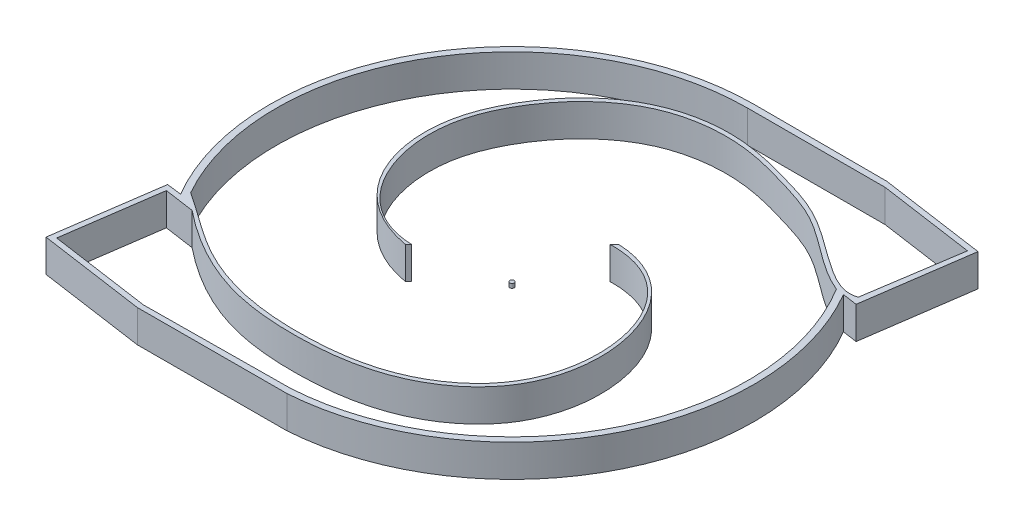
ISO-10303-21;
HEADER;
FILE_DESCRIPTION(('STEP AP214'),'2;1');
FILE_NAME('part.step','',(''),(''),'','','');
FILE_SCHEMA(('AUTOMOTIVE_DESIGN { 1 0 10303 214 1 1 1 1 }'));
ENDSEC;
DATA;
#1=APPLICATION_CONTEXT('core data for automotive mechanical design processes');
#2=APPLICATION_PROTOCOL_DEFINITION('international standard','automotive_design',2000,#1);
#3=PRODUCT_CONTEXT('',#1,'mechanical');
#4=PRODUCT('Part','Part','',(#3));
#5=PRODUCT_RELATED_PRODUCT_CATEGORY('part','',(#4));
#6=PRODUCT_DEFINITION_FORMATION('','',#4);
#7=PRODUCT_DEFINITION_CONTEXT('part definition',#1,'design');
#8=PRODUCT_DEFINITION('design','',#6,#7);
#9=PRODUCT_DEFINITION_SHAPE('','',#8);
#10=(LENGTH_UNIT() NAMED_UNIT(*) SI_UNIT(.MILLI.,.METRE.));
#11=(NAMED_UNIT(*) PLANE_ANGLE_UNIT() SI_UNIT($,.RADIAN.));
#12=(NAMED_UNIT(*) SI_UNIT($,.STERADIAN.) SOLID_ANGLE_UNIT());
#13=UNCERTAINTY_MEASURE_WITH_UNIT(LENGTH_MEASURE(1.E-05),#10,'distance_accuracy_value','');
#14=(GEOMETRIC_REPRESENTATION_CONTEXT(3) GLOBAL_UNCERTAINTY_ASSIGNED_CONTEXT((#13)) GLOBAL_UNIT_ASSIGNED_CONTEXT((#10,
#11,#12)) REPRESENTATION_CONTEXT('',''));
#15=CARTESIAN_POINT('',(0.,0.,0.));
#16=DIRECTION('',(0.,0.,1.));
#17=DIRECTION('',(1.,0.,0.));
#18=AXIS2_PLACEMENT_3D('',#15,#16,#17);
#19=CARTESIAN_POINT('',(0.,-2.,0.));
#20=DIRECTION('',(0.,1.,0.));
#21=DIRECTION('',(0.,0.,1.));
#22=AXIS2_PLACEMENT_3D('',#19,#20,#21);
#23=CYLINDRICAL_SURFACE('',#22,1.);
#24=CARTESIAN_POINT('',(0.,-2.,0.));
#25=DIRECTION('',(0.,-1.,0.));
#26=DIRECTION('',(0.,0.,-1.));
#27=AXIS2_PLACEMENT_3D('',#24,#25,#26);
#28=CIRCLE('',#27,1.);
#29=CARTESIAN_POINT('',(0.,-2.,-1.));
#30=VERTEX_POINT('',#29);
#31=EDGE_CURVE('E11',#30,#30,#28,.T.);
#32=ORIENTED_EDGE('',*,*,#31,.F.);
#33=EDGE_LOOP('',(#32));
#34=FACE_BOUND('',#33,.T.);
#35=CARTESIAN_POINT('',(0.,0.,0.));
#36=DIRECTION('',(0.,-1.,0.));
#37=DIRECTION('',(0.,0.,-1.));
#38=AXIS2_PLACEMENT_3D('',#35,#36,#37);
#39=CIRCLE('',#38,1.);
#40=CARTESIAN_POINT('',(0.,0.,-1.));
#41=VERTEX_POINT('',#40);
#42=EDGE_CURVE('E48',#41,#41,#39,.T.);
#43=ORIENTED_EDGE('',*,*,#42,.T.);
#44=EDGE_LOOP('',(#43));
#45=FACE_BOUND('',#44,.T.);
#46=ADVANCED_FACE('F45',(#34,#45),#23,.T.);
#47=CARTESIAN_POINT('',(0.,-2.,0.));
#48=DIRECTION('',(0.,-1.,0.));
#49=DIRECTION('',(0.,0.,-1.));
#50=AXIS2_PLACEMENT_3D('',#47,#48,#49);
#51=PLANE('',#50);
#52=ORIENTED_EDGE('',*,*,#31,.T.);
#53=EDGE_LOOP('',(#52));
#54=FACE_BOUND('',#53,.T.);
#55=ADVANCED_FACE('F60',(#54),#51,.T.);
#56=CARTESIAN_POINT('',(0.,0.,0.));
#57=DIRECTION('',(0.,-1.,0.));
#58=DIRECTION('',(0.,0.,-1.));
#59=AXIS2_PLACEMENT_3D('',#56,#57,#58);
#60=PLANE('',#59);
#61=ORIENTED_EDGE('',*,*,#42,.F.);
#62=EDGE_LOOP('',(#61));
#63=FACE_BOUND('',#62,.T.);
#64=ADVANCED_FACE('F58',(#63),#60,.F.);
#65=CLOSED_SHELL('',(#46,#55,#64));
#66=MANIFOLD_SOLID_BREP('B2',#65);
#67=CARTESIAN_POINT('',(0.,15.,0.));
#68=DIRECTION('',(0.,1.,0.));
#69=DIRECTION('',(0.,0.,1.));
#70=AXIS2_PLACEMENT_3D('',#67,#68,#69);
#71=PLANE('',#70);
#72=DIRECTION('',(0.989838582297065,0.,0.142195573053936));
#73=VECTOR('',#72,1.);
#74=CARTESIAN_POINT('',(-111.098134084695,15.,105.272050435523));
#75=LINE('',#74,#73);
#76=CARTESIAN_POINT('',(-111.098134084695,15.,105.272050435523));
#77=VERTEX_POINT('',#76);
#78=CARTESIAN_POINT('',(-61.6062049698414,15.,112.38182908822));
#79=VERTEX_POINT('',#78);
#80=EDGE_CURVE('E392',#77,#79,#75,.T.);
#81=ORIENTED_EDGE('',*,*,#80,.T.);
#82=DIRECTION('',(0.999997555947493,0.,-0.00221090457529426));
#83=VECTOR('',#82,1.);
#84=CARTESIAN_POINT('',(-61.6062049698414,15.,112.38182908822));
#85=LINE('',#84,#83);
#86=CARTESIAN_POINT('',(7.81330436556181,15.,112.228348802302));
#87=VERTEX_POINT('',#86);
#88=EDGE_CURVE('E423',#79,#87,#85,.T.);
#89=ORIENTED_EDGE('',*,*,#88,.T.);
#90=CARTESIAN_POINT('',(0.,15.,0.));
#91=DIRECTION('',(0.,1.,0.));
#92=DIRECTION('',(0.,0.,1.));
#93=AXIS2_PLACEMENT_3D('',#90,#91,#92);
#94=CIRCLE('',#93,112.5);
#95=CARTESIAN_POINT('',(97.1283531466702,15.,-56.7655971078939));
#96=VERTEX_POINT('',#95);
#97=EDGE_CURVE('E370',#87,#96,#94,.T.);
#98=ORIENTED_EDGE('',*,*,#97,.T.);
#99=DIRECTION('',(0.989838582297064,0.,0.142195573053939));
#100=VECTOR('',#99,1.);
#101=CARTESIAN_POINT('',(103.988355431997,15.,-55.7801213206704));
#102=LINE('',#101,#100);
#103=CARTESIAN_POINT('',(103.988355431997,15.,-55.7801213206704));
#104=VERTEX_POINT('',#103);
#105=EDGE_CURVE('E417',#96,#104,#102,.T.);
#106=ORIENTED_EDGE('',*,*,#105,.T.);
#107=DIRECTION('',(0.142195573053937,0.,-0.989838582297064));
#108=VECTOR('',#107,1.);
#109=CARTESIAN_POINT('',(111.098134084694,15.,-105.272050435524));
#110=LINE('',#109,#108);
#111=CARTESIAN_POINT('',(111.098134084694,15.,-105.272050435524));
#112=VERTEX_POINT('',#111);
#113=EDGE_CURVE('E419',#104,#112,#110,.T.);
#114=ORIENTED_EDGE('',*,*,#113,.T.);
#115=DIRECTION('',(-0.989838582297064,0.,-0.142195573053938));
#116=VECTOR('',#115,1.);
#117=CARTESIAN_POINT('',(61.6062049698404,15.,-112.38182908822));
#118=LINE('',#117,#116);
#119=CARTESIAN_POINT('',(61.6062049698404,15.,-112.38182908822));
#120=VERTEX_POINT('',#119);
#121=EDGE_CURVE('E421',#112,#120,#118,.T.);
#122=ORIENTED_EDGE('',*,*,#121,.T.);
#123=DIRECTION('',(-0.999998153852846,0.,-0.00192153347591024));
#124=VECTOR('',#123,1.);
#125=CARTESIAN_POINT('',(0.216172516040019,15.,-112.499792308445));
#126=LINE('',#125,#124);
#127=CARTESIAN_POINT('',(0.216172516040015,15.,-112.499792308445));
#128=VERTEX_POINT('',#127);
#129=EDGE_CURVE('E428',#120,#128,#126,.T.);
#130=ORIENTED_EDGE('',*,*,#129,.T.);
#131=CARTESIAN_POINT('',(0.,15.,0.));
#132=DIRECTION('',(0.,1.,0.));
#133=DIRECTION('',(0.,0.,1.));
#134=AXIS2_PLACEMENT_3D('',#131,#132,#133);
#135=CIRCLE('',#134,112.5);
#136=CARTESIAN_POINT('',(-97.1283531467345,15.,56.7655971077838));
#137=VERTEX_POINT('',#136);
#138=EDGE_CURVE('E430',#128,#137,#135,.T.);
#139=ORIENTED_EDGE('',*,*,#138,.T.);
#140=DIRECTION('',(-0.99215332647358,0.,-0.125027104131105));
#141=VECTOR('',#140,1.);
#142=CARTESIAN_POINT('',(-97.1283531467345,15.,56.7655971077838));
#143=LINE('',#142,#141);
#144=CARTESIAN_POINT('',(-104.005429548138,15.,55.8989760680581));
#145=VERTEX_POINT('',#144);
#146=EDGE_CURVE('E432',#137,#145,#143,.T.);
#147=ORIENTED_EDGE('',*,*,#146,.T.);
#148=DIRECTION('',(-0.142195573053945,0.,0.989838582297063));
#149=VECTOR('',#148,1.);
#150=CARTESIAN_POINT('',(-104.005429548138,15.,55.8989760680581));
#151=LINE('',#150,#149);
#152=EDGE_CURVE('E397',#145,#77,#151,.T.);
#153=ORIENTED_EDGE('',*,*,#152,.T.);
#154=EDGE_LOOP('',(#81,#89,#98,#106,#114,#122,#130,#139,#147,#153));
#155=FACE_BOUND('',#154,.T.);
#156=DIRECTION('',(0.150937206661829,0.,-0.988543352435858));
#157=VECTOR('',#156,1.);
#158=CARTESIAN_POINT('',(108.356962433617,15.,-103.140169981502));
#159=LINE('',#158,#157);
#160=CARTESIAN_POINT('',(101.651112979556,15.,-59.2210923275775));
#161=VERTEX_POINT('',#160);
#162=CARTESIAN_POINT('',(108.356962433617,15.,-103.140169981502));
#163=VERTEX_POINT('',#162);
#164=EDGE_CURVE('E255',#161,#163,#159,.T.);
#165=ORIENTED_EDGE('',*,*,#164,.F.);
#166=CARTESIAN_POINT('',(-24.7487373415292,15.,24.7487373415291));
#167=CARTESIAN_POINT('',(-57.6088522938292,15.,18.867382228917));
#168=CARTESIAN_POINT('',(-72.3021396488468,15.,-19.8249873152464));
#169=CARTESIAN_POINT('',(-54.9322718394747,15.,-63.3855746473588));
#170=CARTESIAN_POINT('',(-30.7206221507859,15.,-90.556775661547));
#171=CARTESIAN_POINT('',(10.898716901952,15.,-98.1526440490121));
#172=CARTESIAN_POINT('',(40.3725343305734,15.,-88.6774294833396));
#173=CARTESIAN_POINT('',(38.8536834725888,15.,-89.1413172088945));
#174=CARTESIAN_POINT('',(67.35044256654,15.,-81.8497237142579));
#175=CARTESIAN_POINT('',(91.0384209035717,15.,-54.8393633440072));
#176=CARTESIAN_POINT('',(101.651112979556,15.,-59.2210923275775));
#177=B_SPLINE_CURVE_WITH_KNOTS('',3,(#166,#167,#168,#169,#170,#171,#172,#173,#174,#175,#176),
.UNSPECIFIED.,.F.,.F.,(4,1,1,1,1,1,1,1,4),(0.,0.277456928091752,0.362270070175911,
0.527471754866319,0.633154577027563,0.719972673822301,0.738643837156515,0.8198662103697,1.),.UNSPECIFIED.);
#178=CARTESIAN_POINT('',(-24.7487373415292,15.,24.7487373415291));
#179=VERTEX_POINT('',#178);
#180=EDGE_CURVE('E247',#179,#161,#177,.T.);
#181=ORIENTED_EDGE('',*,*,#180,.F.);
#182=DIRECTION('',(-0.707106781186547,0.,0.707106781186547));
#183=VECTOR('',#182,1.);
#184=CARTESIAN_POINT('',(-23.3345237791561,15.,23.334523779156));
#185=LINE('',#184,#183);
#186=CARTESIAN_POINT('',(-23.3345237791561,15.,23.334523779156));
#187=VERTEX_POINT('',#186);
#188=EDGE_CURVE('E480',#187,#179,#185,.T.);
#189=ORIENTED_EDGE('',*,*,#188,.F.);
#190=CARTESIAN_POINT('',(93.3016841858716,15.,-57.3153184417559));
#191=CARTESIAN_POINT('',(79.999859792646,15.,-62.7848687055692));
#192=CARTESIAN_POINT('',(65.322911503869,15.,-78.768171948633));
#193=CARTESIAN_POINT('',(37.4032729980651,15.,-87.7996070681582));
#194=CARTESIAN_POINT('',(11.7544837331423,15.,-95.0233278977322));
#195=CARTESIAN_POINT('',(-26.3511202667367,15.,-90.7646059425298));
#196=CARTESIAN_POINT('',(-52.9708137900069,15.,-63.4030913343276));
#197=CARTESIAN_POINT('',(-70.9286409504266,15.,-17.7732911126449));
#198=CARTESIAN_POINT('',(-53.1428699296483,15.,22.1928285556717));
#199=CARTESIAN_POINT('',(-23.3345237791561,15.,23.334523779156));
#200=B_SPLINE_CURVE_WITH_KNOTS('',3,(#190,#191,#192,#193,#194,#195,#196,#197,#198,#199),
.UNSPECIFIED.,.F.,.F.,(4,1,1,1,1,1,1,4),(0.,0.160043116734064,0.228106362998641,
0.324072816988821,0.456717013954585,0.632884802041081,0.715223579823086,1.),.UNSPECIFIED.);
#201=CARTESIAN_POINT('',(93.3016841858716,15.,-57.3153184417559));
#202=VERTEX_POINT('',#201);
#203=EDGE_CURVE('E542',#202,#187,#200,.T.);
#204=ORIENTED_EDGE('',*,*,#203,.F.);
#205=CARTESIAN_POINT('',(0.,15.,0.));
#206=DIRECTION('',(0.,1.,0.));
#207=DIRECTION('',(0.,0.,1.));
#208=AXIS2_PLACEMENT_3D('',#205,#206,#207);
#209=CIRCLE('',#208,109.5);
#210=CARTESIAN_POINT('',(6.52858444374937,15.,109.305203833856));
#211=VERTEX_POINT('',#210);
#212=EDGE_CURVE('E547',#211,#202,#209,.T.);
#213=ORIENTED_EDGE('',*,*,#212,.F.);
#214=DIRECTION('',(0.999960555676879,0.,-0.00888184048428879));
#215=VECTOR('',#214,1.);
#216=CARTESIAN_POINT('',(-61.2507160203775,15.,109.907232515329));
#217=LINE('',#216,#215);
#218=CARTESIAN_POINT('',(-61.2507160203775,15.,109.907232515329));
#219=VERTEX_POINT('',#218);
#220=EDGE_CURVE('E594',#219,#211,#217,.T.);
#221=ORIENTED_EDGE('',*,*,#220,.F.);
#222=DIRECTION('',(0.98983858265136,0.,0.142195570587646));
#223=VECTOR('',#222,1.);
#224=CARTESIAN_POINT('',(-61.2507160203775,15.,109.907232515329));
#225=LINE('',#224,#223);
#226=CARTESIAN_POINT('',(-108.268048696317,15.,103.152942912416));
#227=VERTEX_POINT('',#226);
#228=EDGE_CURVE('E593',#227,#219,#225,.T.);
#229=ORIENTED_EDGE('',*,*,#228,.F.);
#230=DIRECTION('',(-0.142195573053947,0.,0.989838582297063));
#231=VECTOR('',#230,1.);
#232=CARTESIAN_POINT('',(-108.268048696317,15.,103.152942912416));
#233=LINE('',#232,#231);
#234=CARTESIAN_POINT('',(-101.86924790889,15.,58.6102067090479));
#235=VERTEX_POINT('',#234);
#236=EDGE_CURVE('E591',#235,#227,#233,.T.);
#237=ORIENTED_EDGE('',*,*,#236,.F.);
#238=DIRECTION('',(-0.989838582297064,0.,-0.142195573053942));
#239=VECTOR('',#238,1.);
#240=CARTESIAN_POINT('',(-101.86924790889,15.,58.6102067090479));
#241=LINE('',#240,#239);
#242=CARTESIAN_POINT('',(-87.9163615031018,15.,60.6146129968118));
#243=VERTEX_POINT('',#242);
#244=EDGE_CURVE('E586',#243,#235,#241,.T.);
#245=ORIENTED_EDGE('',*,*,#244,.F.);
#246=CARTESIAN_POINT('',(24.7487373415291,15.,-24.7487373415292));
#247=CARTESIAN_POINT('',(51.7370589735834,15.,-23.6621696705015));
#248=CARTESIAN_POINT('',(72.1160836691228,15.,11.8170428928419));
#249=CARTESIAN_POINT('',(59.7862809228424,15.,59.0149245980405));
#250=CARTESIAN_POINT('',(28.2090400860088,15.,83.0352889135964));
#251=CARTESIAN_POINT('',(-9.82261115237183,15.,88.3388256270936));
#252=CARTESIAN_POINT('',(-51.5864280904056,15.,84.7534168675822));
#253=CARTESIAN_POINT('',(-75.972753664596,15.,70.2918559629893));
#254=CARTESIAN_POINT('',(-87.9163615031018,15.,60.6146129968118));
#255=B_SPLINE_CURVE_WITH_KNOTS('',3,(#246,#247,#248,#249,#250,#251,#252,#253,#254),
.UNSPECIFIED.,.F.,.F.,(4,1,1,1,1,1,4),(0.,0.260567980555586,0.392123414841288,0.526871298776947,
0.686922118744908,0.822471855273197,1.),.UNSPECIFIED.);
#256=CARTESIAN_POINT('',(24.7487373415291,15.,-24.7487373415292));
#257=VERTEX_POINT('',#256);
#258=EDGE_CURVE('E581',#257,#243,#255,.T.);
#259=ORIENTED_EDGE('',*,*,#258,.F.);
#260=DIRECTION('',(0.707106781186552,0.,-0.707106781186543));
#261=VECTOR('',#260,1.);
#262=CARTESIAN_POINT('',(22.7487373415291,15.,-22.7487373415292));
#263=LINE('',#262,#261);
#264=CARTESIAN_POINT('',(22.7487373415291,15.,-22.7487373415292));
#265=VERTEX_POINT('',#264);
#266=EDGE_CURVE('E284',#265,#257,#263,.T.);
#267=ORIENTED_EDGE('',*,*,#266,.F.);
#268=CARTESIAN_POINT('',(-95.321840889812,15.,53.8887432529036));
#269=CARTESIAN_POINT('',(-85.595236890725,15.,60.1599095727363));
#270=CARTESIAN_POINT('',(-71.2177238612191,15.,72.0334175299913));
#271=CARTESIAN_POINT('',(-42.2900753972253,15.,83.597289834803));
#272=CARTESIAN_POINT('',(-9.76379503867826,15.,86.3617363395996));
#273=CARTESIAN_POINT('',(27.6960347768642,15.,80.9951888851578));
#274=CARTESIAN_POINT('',(58.3489292927927,15.,57.6593810689266));
#275=CARTESIAN_POINT('',(70.0831906316323,15.,11.1972146755611));
#276=CARTESIAN_POINT('',(50.5690623695877,15.,-23.495909322841));
#277=CARTESIAN_POINT('',(22.7487373415291,15.,-22.7487373415292));
#278=B_SPLINE_CURVE_WITH_KNOTS('',3,(#268,#269,#270,#271,#272,#273,#274,#275,#276,#277),
.UNSPECIFIED.,.F.,.F.,(4,1,1,1,1,1,1,4),(0.,0.130192876402193,0.206823632700945,
0.345938150979102,0.492014560699875,0.6235083770681,0.750750137569799,1.),.UNSPECIFIED.);
#279=CARTESIAN_POINT('',(-95.321840889812,15.,53.8887432529036));
#280=VERTEX_POINT('',#279);
#281=EDGE_CURVE('E279',#280,#265,#278,.T.);
#282=ORIENTED_EDGE('',*,*,#281,.F.);
#283=CARTESIAN_POINT('',(0.,15.,0.));
#284=DIRECTION('',(0.,1.,0.));
#285=DIRECTION('',(0.,0.,1.));
#286=AXIS2_PLACEMENT_3D('',#283,#284,#285);
#287=CIRCLE('',#286,109.5);
#288=CARTESIAN_POINT('',(-0.0888498760573432,15.,-109.49996395296));
#289=VERTEX_POINT('',#288);
#290=EDGE_CURVE('E277',#289,#280,#287,.T.);
#291=ORIENTED_EDGE('',*,*,#290,.F.);
#292=DIRECTION('',(-0.999999670803287,0.,0.000811414393217913));
#293=VECTOR('',#292,1.);
#294=CARTESIAN_POINT('',(24.7487373415291,15.,-109.520117535356));
#295=LINE('',#294,#293);
#296=CARTESIAN_POINT('',(63.7253124929482,15.,-109.551743699843));
#297=VERTEX_POINT('',#296);
#298=EDGE_CURVE('E270',#297,#289,#295,.T.);
#299=ORIENTED_EDGE('',*,*,#298,.F.);
#300=DIRECTION('',(-0.989838582297064,0.,-0.142195573053937));
#301=VECTOR('',#300,1.);
#302=CARTESIAN_POINT('',(63.7253124929482,15.,-109.551743699843));
#303=LINE('',#302,#301);
#304=EDGE_CURVE('E268',#163,#297,#303,.T.);
#305=ORIENTED_EDGE('',*,*,#304,.F.);
#306=EDGE_LOOP('',(#165,#181,#189,#204,#213,#221,#229,#237,#245,#259,#267,#282,#291,#299,#305));
#307=FACE_BOUND('',#306,.T.);
#308=ADVANCED_FACE('F80',(#155,#307),#71,.T.);
#309=CARTESIAN_POINT('',(0.,0.,0.));
#310=DIRECTION('',(0.,1.,0.));
#311=DIRECTION('',(0.,0.,1.));
#312=AXIS2_PLACEMENT_3D('',#309,#310,#311);
#313=PLANE('',#312);
#314=DIRECTION('',(0.989838582297065,0.,0.142195573053936));
#315=VECTOR('',#314,1.);
#316=CARTESIAN_POINT('',(-111.098134084695,0.,105.272050435523));
#317=LINE('',#316,#315);
#318=CARTESIAN_POINT('',(-111.098134084695,0.,105.272050435523));
#319=VERTEX_POINT('',#318);
#320=CARTESIAN_POINT('',(-61.6062049698414,0.,112.38182908822));
#321=VERTEX_POINT('',#320);
#322=EDGE_CURVE('E263',#319,#321,#317,.T.);
#323=ORIENTED_EDGE('',*,*,#322,.F.);
#324=DIRECTION('',(-0.142195573053945,0.,0.989838582297063));
#325=VECTOR('',#324,1.);
#326=CARTESIAN_POINT('',(-104.005429548138,0.,55.8989760680581));
#327=LINE('',#326,#325);
#328=CARTESIAN_POINT('',(-104.005429548138,0.,55.8989760680581));
#329=VERTEX_POINT('',#328);
#330=EDGE_CURVE('E390',#329,#319,#327,.T.);
#331=ORIENTED_EDGE('',*,*,#330,.F.);
#332=DIRECTION('',(-0.99215332647358,0.,-0.125027104131105));
#333=VECTOR('',#332,1.);
#334=CARTESIAN_POINT('',(-97.1283531467345,0.,56.7655971077838));
#335=LINE('',#334,#333);
#336=CARTESIAN_POINT('',(-97.1283531467345,0.,56.7655971077838));
#337=VERTEX_POINT('',#336);
#338=EDGE_CURVE('E388',#337,#329,#335,.T.);
#339=ORIENTED_EDGE('',*,*,#338,.F.);
#340=CARTESIAN_POINT('',(0.,0.,0.));
#341=DIRECTION('',(0.,1.,0.));
#342=DIRECTION('',(0.,0.,1.));
#343=AXIS2_PLACEMENT_3D('',#340,#341,#342);
#344=CIRCLE('',#343,112.5);
#345=CARTESIAN_POINT('',(0.216172516040015,0.,-112.499792308445));
#346=VERTEX_POINT('',#345);
#347=EDGE_CURVE('E386',#346,#337,#344,.T.);
#348=ORIENTED_EDGE('',*,*,#347,.F.);
#349=DIRECTION('',(-0.999998153852846,0.,-0.00192153347591024));
#350=VECTOR('',#349,1.);
#351=CARTESIAN_POINT('',(0.216172516040019,0.,-112.499792308445));
#352=LINE('',#351,#350);
#353=CARTESIAN_POINT('',(61.6062049698404,0.,-112.38182908822));
#354=VERTEX_POINT('',#353);
#355=EDGE_CURVE('E384',#354,#346,#352,.T.);
#356=ORIENTED_EDGE('',*,*,#355,.F.);
#357=DIRECTION('',(-0.989838582297064,0.,-0.142195573053938));
#358=VECTOR('',#357,1.);
#359=CARTESIAN_POINT('',(61.6062049698404,0.,-112.38182908822));
#360=LINE('',#359,#358);
#361=CARTESIAN_POINT('',(111.098134084694,0.,-105.272050435524));
#362=VERTEX_POINT('',#361);
#363=EDGE_CURVE('E382',#362,#354,#360,.T.);
#364=ORIENTED_EDGE('',*,*,#363,.F.);
#365=DIRECTION('',(0.142195573053937,0.,-0.989838582297064));
#366=VECTOR('',#365,1.);
#367=CARTESIAN_POINT('',(111.098134084694,0.,-105.272050435524));
#368=LINE('',#367,#366);
#369=CARTESIAN_POINT('',(103.988355431997,0.,-55.7801213206704));
#370=VERTEX_POINT('',#369);
#371=EDGE_CURVE('E377',#370,#362,#368,.T.);
#372=ORIENTED_EDGE('',*,*,#371,.F.);
#373=DIRECTION('',(0.989838582297064,0.,0.142195573053939));
#374=VECTOR('',#373,1.);
#375=CARTESIAN_POINT('',(103.988355431997,0.,-55.7801213206704));
#376=LINE('',#375,#374);
#377=CARTESIAN_POINT('',(97.1283531466702,0.,-56.7655971078939));
#378=VERTEX_POINT('',#377);
#379=EDGE_CURVE('E375',#378,#370,#376,.T.);
#380=ORIENTED_EDGE('',*,*,#379,.F.);
#381=CARTESIAN_POINT('',(0.,0.,0.));
#382=DIRECTION('',(0.,1.,0.));
#383=DIRECTION('',(0.,0.,1.));
#384=AXIS2_PLACEMENT_3D('',#381,#382,#383);
#385=CIRCLE('',#384,112.5);
#386=CARTESIAN_POINT('',(7.81330436556181,0.,112.228348802302));
#387=VERTEX_POINT('',#386);
#388=EDGE_CURVE('E366',#387,#378,#385,.T.);
#389=ORIENTED_EDGE('',*,*,#388,.F.);
#390=DIRECTION('',(0.999997555947493,0.,-0.00221090457529426));
#391=VECTOR('',#390,1.);
#392=CARTESIAN_POINT('',(-61.6062049698414,0.,112.38182908822));
#393=LINE('',#392,#391);
#394=EDGE_CURVE('E359',#321,#387,#393,.T.);
#395=ORIENTED_EDGE('',*,*,#394,.F.);
#396=EDGE_LOOP('',(#323,#331,#339,#348,#356,#364,#372,#380,#389,#395));
#397=FACE_BOUND('',#396,.T.);
#398=CARTESIAN_POINT('',(-24.7487373415292,0.,24.7487373415291));
#399=CARTESIAN_POINT('',(-57.6088522938292,0.,18.867382228917));
#400=CARTESIAN_POINT('',(-72.3021396488468,0.,-19.8249873152464));
#401=CARTESIAN_POINT('',(-54.9322718394747,0.,-63.3855746473588));
#402=CARTESIAN_POINT('',(-30.7206221507859,0.,-90.556775661547));
#403=CARTESIAN_POINT('',(10.898716901952,0.,-98.1526440490121));
#404=CARTESIAN_POINT('',(40.3725343305734,0.,-88.6774294833396));
#405=CARTESIAN_POINT('',(38.8536834725888,0.,-89.1413172088945));
#406=CARTESIAN_POINT('',(67.35044256654,0.,-81.8497237142579));
#407=CARTESIAN_POINT('',(91.0384209035717,0.,-54.8393633440072));
#408=CARTESIAN_POINT('',(101.651112979556,0.,-59.2210923275775));
#409=B_SPLINE_CURVE_WITH_KNOTS('',3,(#398,#399,#400,#401,#402,#403,#404,#405,#406,#407,#408),
.UNSPECIFIED.,.F.,.F.,(4,1,1,1,1,1,1,1,4),(0.,0.277456928091752,0.362270070175911,
0.527471754866319,0.633154577027563,0.719972673822301,0.738643837156515,0.8198662103697,1.),.UNSPECIFIED.);
#410=CARTESIAN_POINT('',(-24.7487373415292,0.,24.7487373415291));
#411=VERTEX_POINT('',#410);
#412=CARTESIAN_POINT('',(101.651112979556,0.,-59.2210923275775));
#413=VERTEX_POINT('',#412);
#414=EDGE_CURVE('E103',#411,#413,#409,.T.);
#415=ORIENTED_EDGE('',*,*,#414,.T.);
#416=DIRECTION('',(0.150937206661829,0.,-0.988543352435858));
#417=VECTOR('',#416,1.);
#418=CARTESIAN_POINT('',(108.356962433617,0.,-103.140169981502));
#419=LINE('',#418,#417);
#420=CARTESIAN_POINT('',(108.356962433617,0.,-103.140169981502));
#421=VERTEX_POINT('',#420);
#422=EDGE_CURVE('E262',#413,#421,#419,.T.);
#423=ORIENTED_EDGE('',*,*,#422,.T.);
#424=DIRECTION('',(-0.989838582297064,0.,-0.142195573053937));
#425=VECTOR('',#424,1.);
#426=CARTESIAN_POINT('',(63.7253124929482,0.,-109.551743699843));
#427=LINE('',#426,#425);
#428=CARTESIAN_POINT('',(63.7253124929482,0.,-109.551743699843));
#429=VERTEX_POINT('',#428);
#430=EDGE_CURVE('E531',#421,#429,#427,.T.);
#431=ORIENTED_EDGE('',*,*,#430,.T.);
#432=DIRECTION('',(-0.999999670803287,0.,0.000811414393217615));
#433=VECTOR('',#432,1.);
#434=CARTESIAN_POINT('',(-0.0888498760573432,0.,-109.49996395296));
#435=LINE('',#434,#433);
#436=CARTESIAN_POINT('',(-0.0888498760573432,0.,-109.49996395296));
#437=VERTEX_POINT('',#436);
#438=EDGE_CURVE('E528',#429,#437,#435,.T.);
#439=ORIENTED_EDGE('',*,*,#438,.T.);
#440=CARTESIAN_POINT('',(0.,0.,0.));
#441=DIRECTION('',(0.,1.,0.));
#442=DIRECTION('',(0.,0.,1.));
#443=AXIS2_PLACEMENT_3D('',#440,#441,#442);
#444=CIRCLE('',#443,109.5);
#445=CARTESIAN_POINT('',(-95.321840889812,0.,53.8887432529036));
#446=VERTEX_POINT('',#445);
#447=EDGE_CURVE('E522',#437,#446,#444,.T.);
#448=ORIENTED_EDGE('',*,*,#447,.T.);
#449=CARTESIAN_POINT('',(-95.321840889812,0.,53.8887432529036));
#450=CARTESIAN_POINT('',(-85.595236890725,0.,60.1599095727363));
#451=CARTESIAN_POINT('',(-71.2177238612191,0.,72.0334175299913));
#452=CARTESIAN_POINT('',(-42.2900753972253,0.,83.597289834803));
#453=CARTESIAN_POINT('',(-9.76379503867826,0.,86.3617363395996));
#454=CARTESIAN_POINT('',(27.6960347768642,0.,80.9951888851578));
#455=CARTESIAN_POINT('',(58.3489292927927,0.,57.6593810689266));
#456=CARTESIAN_POINT('',(70.0831906316323,0.,11.1972146755611));
#457=CARTESIAN_POINT('',(50.5690623695877,0.,-23.495909322841));
#458=CARTESIAN_POINT('',(22.7487373415291,0.,-22.7487373415292));
#459=B_SPLINE_CURVE_WITH_KNOTS('',3,(#449,#450,#451,#452,#453,#454,#455,#456,#457,#458),
.UNSPECIFIED.,.F.,.F.,(4,1,1,1,1,1,1,4),(0.,0.130192876402193,0.206823632700945,
0.345938150979102,0.492014560699875,0.6235083770681,0.750750137569799,1.),.UNSPECIFIED.);
#460=CARTESIAN_POINT('',(22.7487373415291,0.,-22.7487373415292));
#461=VERTEX_POINT('',#460);
#462=EDGE_CURVE('E517',#446,#461,#459,.T.);
#463=ORIENTED_EDGE('',*,*,#462,.T.);
#464=DIRECTION('',(0.707106781186552,0.,-0.707106781186543));
#465=VECTOR('',#464,1.);
#466=CARTESIAN_POINT('',(22.7487373415291,0.,-22.7487373415292));
#467=LINE('',#466,#465);
#468=CARTESIAN_POINT('',(24.7487373415291,0.,-24.7487373415292));
#469=VERTEX_POINT('',#468);
#470=EDGE_CURVE('E511',#461,#469,#467,.T.);
#471=ORIENTED_EDGE('',*,*,#470,.T.);
#472=CARTESIAN_POINT('',(24.7487373415291,0.,-24.7487373415292));
#473=CARTESIAN_POINT('',(51.7370589735834,0.,-23.6621696705015));
#474=CARTESIAN_POINT('',(72.1160836691228,0.,11.8170428928419));
#475=CARTESIAN_POINT('',(59.7862809228424,0.,59.0149245980405));
#476=CARTESIAN_POINT('',(28.2090400860088,0.,83.0352889135964));
#477=CARTESIAN_POINT('',(-9.82261115237183,0.,88.3388256270936));
#478=CARTESIAN_POINT('',(-51.5864280904056,0.,84.7534168675822));
#479=CARTESIAN_POINT('',(-75.972753664596,0.,70.2918559629893));
#480=CARTESIAN_POINT('',(-87.9163615031018,0.,60.6146129968118));
#481=B_SPLINE_CURVE_WITH_KNOTS('',3,(#472,#473,#474,#475,#476,#477,#478,#479,#480),
.UNSPECIFIED.,.F.,.F.,(4,1,1,1,1,1,4),(0.,0.260567980555586,0.392123414841288,0.526871298776947,
0.686922118744908,0.822471855273197,1.),.UNSPECIFIED.);
#482=CARTESIAN_POINT('',(-87.9163615031018,0.,60.6146129968118));
#483=VERTEX_POINT('',#482);
#484=EDGE_CURVE('E506',#469,#483,#481,.T.);
#485=ORIENTED_EDGE('',*,*,#484,.T.);
#486=DIRECTION('',(-0.989838582297064,0.,-0.142195573053942));
#487=VECTOR('',#486,1.);
#488=CARTESIAN_POINT('',(-101.86924790889,0.,58.6102067090479));
#489=LINE('',#488,#487);
#490=CARTESIAN_POINT('',(-101.86924790889,0.,58.6102067090479));
#491=VERTEX_POINT('',#490);
#492=EDGE_CURVE('E503',#483,#491,#489,.T.);
#493=ORIENTED_EDGE('',*,*,#492,.T.);
#494=DIRECTION('',(-0.142195573053947,0.,0.989838582297063));
#495=VECTOR('',#494,1.);
#496=CARTESIAN_POINT('',(-108.268048696317,0.,103.152942912416));
#497=LINE('',#496,#495);
#498=CARTESIAN_POINT('',(-108.268048696317,0.,103.152942912416));
#499=VERTEX_POINT('',#498);
#500=EDGE_CURVE('E500',#491,#499,#497,.T.);
#501=ORIENTED_EDGE('',*,*,#500,.T.);
#502=DIRECTION('',(0.98983858265136,0.,0.142195570587646));
#503=VECTOR('',#502,1.);
#504=CARTESIAN_POINT('',(-61.2507160203775,0.,109.907232515329));
#505=LINE('',#504,#503);
#506=CARTESIAN_POINT('',(-61.2507160203775,0.,109.907232515329));
#507=VERTEX_POINT('',#506);
#508=EDGE_CURVE('E497',#499,#507,#505,.T.);
#509=ORIENTED_EDGE('',*,*,#508,.T.);
#510=DIRECTION('',(0.999960555676879,0.,-0.00888184048428879));
#511=VECTOR('',#510,1.);
#512=CARTESIAN_POINT('',(-61.2507160203775,0.,109.907232515329));
#513=LINE('',#512,#511);
#514=CARTESIAN_POINT('',(6.52858444374937,0.,109.305203833856));
#515=VERTEX_POINT('',#514);
#516=EDGE_CURVE('E494',#507,#515,#513,.T.);
#517=ORIENTED_EDGE('',*,*,#516,.T.);
#518=CARTESIAN_POINT('',(0.,0.,0.));
#519=DIRECTION('',(0.,1.,0.));
#520=DIRECTION('',(0.,0.,1.));
#521=AXIS2_PLACEMENT_3D('',#518,#519,#520);
#522=CIRCLE('',#521,109.5);
#523=CARTESIAN_POINT('',(93.3016841858716,0.,-57.3153184417559));
#524=VERTEX_POINT('',#523);
#525=EDGE_CURVE('E488',#515,#524,#522,.T.);
#526=ORIENTED_EDGE('',*,*,#525,.T.);
#527=CARTESIAN_POINT('',(93.3016841858716,0.,-57.3153184417559));
#528=CARTESIAN_POINT('',(79.999859792646,0.,-62.7848687055692));
#529=CARTESIAN_POINT('',(65.322911503869,0.,-78.768171948633));
#530=CARTESIAN_POINT('',(37.4032729980651,0.,-87.7996070681582));
#531=CARTESIAN_POINT('',(11.7544837331423,0.,-95.0233278977322));
#532=CARTESIAN_POINT('',(-26.3511202667367,0.,-90.7646059425298));
#533=CARTESIAN_POINT('',(-52.9708137900069,0.,-63.4030913343276));
#534=CARTESIAN_POINT('',(-70.9286409504266,0.,-17.7732911126449));
#535=CARTESIAN_POINT('',(-53.1428699296483,0.,22.1928285556717));
#536=CARTESIAN_POINT('',(-23.3345237791561,0.,23.334523779156));
#537=B_SPLINE_CURVE_WITH_KNOTS('',3,(#527,#528,#529,#530,#531,#532,#533,#534,#535,#536),
.UNSPECIFIED.,.F.,.F.,(4,1,1,1,1,1,1,4),(0.,0.160043116734064,0.228106362998641,
0.324072816988821,0.456717013954585,0.632884802041081,0.715223579823086,1.),.UNSPECIFIED.);
#538=CARTESIAN_POINT('',(-23.3345237791561,0.,23.334523779156));
#539=VERTEX_POINT('',#538);
#540=EDGE_CURVE('E483',#524,#539,#537,.T.);
#541=ORIENTED_EDGE('',*,*,#540,.T.);
#542=DIRECTION('',(-0.707106781186547,0.,0.707106781186547));
#543=VECTOR('',#542,1.);
#544=CARTESIAN_POINT('',(-23.3345237791561,0.,23.334523779156));
#545=LINE('',#544,#543);
#546=EDGE_CURVE('E256',#539,#411,#545,.T.);
#547=ORIENTED_EDGE('',*,*,#546,.T.);
#548=EDGE_LOOP('',(#415,#423,#431,#439,#448,#463,#471,#485,#493,#501,#509,#517,#526,#541,#547));
#549=FACE_BOUND('',#548,.T.);
#550=ADVANCED_FACE('F316',(#397,#549),#313,.F.);
#551=CARTESIAN_POINT('',(-111.098134084695,15.,105.272050435523));
#552=DIRECTION('',(0.142195573053936,0.,-0.989838582297065));
#553=DIRECTION('',(-0.989838582297065,0.,-0.142195573053936));
#554=AXIS2_PLACEMENT_3D('',#551,#552,#553);
#555=PLANE('',#554);
#556=ORIENTED_EDGE('',*,*,#322,.T.);
#557=DIRECTION('',(0.,-1.,0.));
#558=VECTOR('',#557,1.);
#559=CARTESIAN_POINT('',(-61.6062049698414,15.,112.38182908822));
#560=LINE('',#559,#558);
#561=EDGE_CURVE('E43',#79,#321,#560,.T.);
#562=ORIENTED_EDGE('',*,*,#561,.F.);
#563=ORIENTED_EDGE('',*,*,#80,.F.);
#564=DIRECTION('',(0.,-1.,0.));
#565=VECTOR('',#564,1.);
#566=CARTESIAN_POINT('',(-111.098134084695,15.,105.272050435523));
#567=LINE('',#566,#565);
#568=EDGE_CURVE('E393',#77,#319,#567,.T.);
#569=ORIENTED_EDGE('',*,*,#568,.T.);
#570=EDGE_LOOP('',(#556,#562,#563,#569));
#571=FACE_BOUND('',#570,.T.);
#572=ADVANCED_FACE('F82',(#571),#555,.F.);
#573=CARTESIAN_POINT('',(-61.6062049698414,15.,112.38182908822));
#574=DIRECTION('',(-0.00221090457529426,0.,-0.999997555947493));
#575=DIRECTION('',(-0.999997555947493,0.,0.00221090457529426));
#576=AXIS2_PLACEMENT_3D('',#573,#574,#575);
#577=PLANE('',#576);
#578=ORIENTED_EDGE('',*,*,#394,.T.);
#579=DIRECTION('',(0.,-1.,0.));
#580=VECTOR('',#579,1.);
#581=CARTESIAN_POINT('',(7.81330436556181,15.,112.228348802302));
#582=LINE('',#581,#580);
#583=EDGE_CURVE('E88',#87,#387,#582,.T.);
#584=ORIENTED_EDGE('',*,*,#583,.F.);
#585=ORIENTED_EDGE('',*,*,#88,.F.);
#586=ORIENTED_EDGE('',*,*,#561,.T.);
#587=EDGE_LOOP('',(#578,#584,#585,#586));
#588=FACE_BOUND('',#587,.T.);
#589=ADVANCED_FACE('F350',(#588),#577,.F.);
#590=CARTESIAN_POINT('',(0.,15.,0.));
#591=DIRECTION('',(0.,-1.,0.));
#592=DIRECTION('',(0.,0.,-1.));
#593=AXIS2_PLACEMENT_3D('',#590,#591,#592);
#594=CYLINDRICAL_SURFACE('',#593,112.5);
#595=ORIENTED_EDGE('',*,*,#388,.T.);
#596=DIRECTION('',(0.,-1.,0.));
#597=VECTOR('',#596,1.);
#598=CARTESIAN_POINT('',(97.1283531466702,15.,-56.7655971078939));
#599=LINE('',#598,#597);
#600=EDGE_CURVE('E371',#96,#378,#599,.T.);
#601=ORIENTED_EDGE('',*,*,#600,.F.);
#602=ORIENTED_EDGE('',*,*,#97,.F.);
#603=ORIENTED_EDGE('',*,*,#583,.T.);
#604=EDGE_LOOP('',(#595,#601,#602,#603));
#605=FACE_BOUND('',#604,.T.);
#606=ADVANCED_FACE('F347',(#605),#594,.T.);
#607=CARTESIAN_POINT('',(103.988355431997,15.,-55.7801213206704));
#608=DIRECTION('',(0.142195573053939,0.,-0.989838582297064));
#609=DIRECTION('',(-0.989838582297064,0.,-0.142195573053939));
#610=AXIS2_PLACEMENT_3D('',#607,#608,#609);
#611=PLANE('',#610);
#612=ORIENTED_EDGE('',*,*,#379,.T.);
#613=DIRECTION('',(0.,-1.,0.));
#614=VECTOR('',#613,1.);
#615=CARTESIAN_POINT('',(103.988355431997,15.,-55.7801213206704));
#616=LINE('',#615,#614);
#617=EDGE_CURVE('E412',#104,#370,#616,.T.);
#618=ORIENTED_EDGE('',*,*,#617,.F.);
#619=ORIENTED_EDGE('',*,*,#105,.F.);
#620=ORIENTED_EDGE('',*,*,#600,.T.);
#621=EDGE_LOOP('',(#612,#618,#619,#620));
#622=FACE_BOUND('',#621,.T.);
#623=ADVANCED_FACE('F343',(#622),#611,.F.);
#624=CARTESIAN_POINT('',(111.098134084694,15.,-105.272050435524));
#625=DIRECTION('',(-0.989838582297065,0.,-0.142195573053937));
#626=DIRECTION('',(-0.142195573053937,0.,0.989838582297064));
#627=AXIS2_PLACEMENT_3D('',#624,#625,#626);
#628=PLANE('',#627);
#629=ORIENTED_EDGE('',*,*,#371,.T.);
#630=DIRECTION('',(0.,-1.,0.));
#631=VECTOR('',#630,1.);
#632=CARTESIAN_POINT('',(111.098134084694,15.,-105.272050435524));
#633=LINE('',#632,#631);
#634=EDGE_CURVE('E409',#112,#362,#633,.T.);
#635=ORIENTED_EDGE('',*,*,#634,.F.);
#636=ORIENTED_EDGE('',*,*,#113,.F.);
#637=ORIENTED_EDGE('',*,*,#617,.T.);
#638=EDGE_LOOP('',(#629,#635,#636,#637));
#639=FACE_BOUND('',#638,.T.);
#640=ADVANCED_FACE('F339',(#639),#628,.F.);
#641=CARTESIAN_POINT('',(61.6062049698404,15.,-112.38182908822));
#642=DIRECTION('',(-0.142195573053938,0.,0.989838582297064));
#643=DIRECTION('',(0.989838582297064,0.,0.142195573053938));
#644=AXIS2_PLACEMENT_3D('',#641,#642,#643);
#645=PLANE('',#644);
#646=ORIENTED_EDGE('',*,*,#363,.T.);
#647=DIRECTION('',(0.,-1.,0.));
#648=VECTOR('',#647,1.);
#649=CARTESIAN_POINT('',(61.6062049698404,15.,-112.38182908822));
#650=LINE('',#649,#648);
#651=EDGE_CURVE('E406',#120,#354,#650,.T.);
#652=ORIENTED_EDGE('',*,*,#651,.F.);
#653=ORIENTED_EDGE('',*,*,#121,.F.);
#654=ORIENTED_EDGE('',*,*,#634,.T.);
#655=EDGE_LOOP('',(#646,#652,#653,#654));
#656=FACE_BOUND('',#655,.T.);
#657=ADVANCED_FACE('F335',(#656),#645,.F.);
#658=CARTESIAN_POINT('',(0.216172516040019,15.,-112.499792308445));
#659=DIRECTION('',(-0.00192153347591024,0.,0.999998153852846));
#660=DIRECTION('',(0.999998153852846,0.,0.00192153347591024));
#661=AXIS2_PLACEMENT_3D('',#658,#659,#660);
#662=PLANE('',#661);
#663=ORIENTED_EDGE('',*,*,#355,.T.);
#664=DIRECTION('',(0.,-1.,0.));
#665=VECTOR('',#664,1.);
#666=CARTESIAN_POINT('',(0.216172516040015,15.,-112.499792308445));
#667=LINE('',#666,#665);
#668=EDGE_CURVE('E403',#128,#346,#667,.T.);
#669=ORIENTED_EDGE('',*,*,#668,.F.);
#670=ORIENTED_EDGE('',*,*,#129,.F.);
#671=ORIENTED_EDGE('',*,*,#651,.T.);
#672=EDGE_LOOP('',(#663,#669,#670,#671));
#673=FACE_BOUND('',#672,.T.);
#674=ADVANCED_FACE('F331',(#673),#662,.F.);
#675=CARTESIAN_POINT('',(0.,15.,0.));
#676=DIRECTION('',(0.,-1.,0.));
#677=DIRECTION('',(0.,0.,-1.));
#678=AXIS2_PLACEMENT_3D('',#675,#676,#677);
#679=CYLINDRICAL_SURFACE('',#678,112.5);
#680=ORIENTED_EDGE('',*,*,#347,.T.);
#681=DIRECTION('',(0.,-1.,0.));
#682=VECTOR('',#681,1.);
#683=CARTESIAN_POINT('',(-97.1283531467345,15.,56.7655971077838));
#684=LINE('',#683,#682);
#685=EDGE_CURVE('E400',#137,#337,#684,.T.);
#686=ORIENTED_EDGE('',*,*,#685,.F.);
#687=ORIENTED_EDGE('',*,*,#138,.F.);
#688=ORIENTED_EDGE('',*,*,#668,.T.);
#689=EDGE_LOOP('',(#680,#686,#687,#688));
#690=FACE_BOUND('',#689,.T.);
#691=ADVANCED_FACE('F327',(#690),#679,.T.);
#692=CARTESIAN_POINT('',(-97.1283531467345,15.,56.7655971077838));
#693=DIRECTION('',(-0.125027104131105,0.,0.99215332647358));
#694=DIRECTION('',(0.99215332647358,0.,0.125027104131105));
#695=AXIS2_PLACEMENT_3D('',#692,#693,#694);
#696=PLANE('',#695);
#697=ORIENTED_EDGE('',*,*,#338,.T.);
#698=DIRECTION('',(0.,-1.,0.));
#699=VECTOR('',#698,1.);
#700=CARTESIAN_POINT('',(-104.005429548138,15.,55.8989760680581));
#701=LINE('',#700,#699);
#702=EDGE_CURVE('E396',#145,#329,#701,.T.);
#703=ORIENTED_EDGE('',*,*,#702,.F.);
#704=ORIENTED_EDGE('',*,*,#146,.F.);
#705=ORIENTED_EDGE('',*,*,#685,.T.);
#706=EDGE_LOOP('',(#697,#703,#704,#705));
#707=FACE_BOUND('',#706,.T.);
#708=ADVANCED_FACE('F323',(#707),#696,.F.);
#709=CARTESIAN_POINT('',(-104.005429548138,15.,55.8989760680581));
#710=DIRECTION('',(0.989838582297063,0.,0.142195573053945));
#711=DIRECTION('',(0.142195573053946,0.,-0.989838582297063));
#712=AXIS2_PLACEMENT_3D('',#709,#710,#711);
#713=PLANE('',#712);
#714=ORIENTED_EDGE('',*,*,#330,.T.);
#715=ORIENTED_EDGE('',*,*,#568,.F.);
#716=ORIENTED_EDGE('',*,*,#152,.F.);
#717=ORIENTED_EDGE('',*,*,#702,.T.);
#718=EDGE_LOOP('',(#714,#715,#716,#717));
#719=FACE_BOUND('',#718,.T.);
#720=ADVANCED_FACE('F313',(#719),#713,.F.);
#721=DIRECTION('',(0.,-1.,0.));
#722=VECTOR('',#721,1.);
#723=SURFACE_OF_LINEAR_EXTRUSION('',#177,#722);
#724=ORIENTED_EDGE('',*,*,#414,.F.);
#725=DIRECTION('',(0.,-1.,0.));
#726=VECTOR('',#725,1.);
#727=CARTESIAN_POINT('',(-24.7487373415292,15.,24.7487373415291));
#728=LINE('',#727,#726);
#729=EDGE_CURVE('E251',#179,#411,#728,.T.);
#730=ORIENTED_EDGE('',*,*,#729,.F.);
#731=ORIENTED_EDGE('',*,*,#180,.T.);
#732=DIRECTION('',(0.,-1.,0.));
#733=VECTOR('',#732,1.);
#734=CARTESIAN_POINT('',(101.651112979556,15.,-59.2210923275775));
#735=LINE('',#734,#733);
#736=EDGE_CURVE('E250',#161,#413,#735,.T.);
#737=ORIENTED_EDGE('',*,*,#736,.T.);
#738=EDGE_LOOP('',(#724,#730,#731,#737));
#739=FACE_BOUND('',#738,.T.);
#740=ADVANCED_FACE('F249',(#739),#723,.T.);
#741=CARTESIAN_POINT('',(108.356962433617,15.,-103.140169981502));
#742=DIRECTION('',(-0.988543352435858,0.,-0.150937206661829));
#743=DIRECTION('',(-0.150937206661829,0.,0.988543352435858));
#744=AXIS2_PLACEMENT_3D('',#741,#742,#743);
#745=PLANE('',#744);
#746=ORIENTED_EDGE('',*,*,#422,.F.);
#747=ORIENTED_EDGE('',*,*,#736,.F.);
#748=ORIENTED_EDGE('',*,*,#164,.T.);
#749=DIRECTION('',(0.,-1.,0.));
#750=VECTOR('',#749,1.);
#751=CARTESIAN_POINT('',(108.356962433617,15.,-103.140169981502));
#752=LINE('',#751,#750);
#753=EDGE_CURVE('E264',#163,#421,#752,.T.);
#754=ORIENTED_EDGE('',*,*,#753,.T.);
#755=EDGE_LOOP('',(#746,#747,#748,#754));
#756=FACE_BOUND('',#755,.T.);
#757=ADVANCED_FACE('F259',(#756),#745,.T.);
#758=CARTESIAN_POINT('',(63.7253124929482,15.,-109.551743699843));
#759=DIRECTION('',(-0.142195573053937,0.,0.989838582297064));
#760=DIRECTION('',(0.989838582297064,0.,0.142195573053937));
#761=AXIS2_PLACEMENT_3D('',#758,#759,#760);
#762=PLANE('',#761);
#763=ORIENTED_EDGE('',*,*,#430,.F.);
#764=ORIENTED_EDGE('',*,*,#753,.F.);
#765=ORIENTED_EDGE('',*,*,#304,.T.);
#766=DIRECTION('',(0.,-1.,0.));
#767=VECTOR('',#766,1.);
#768=CARTESIAN_POINT('',(63.7253124929482,15.,-109.551743699843));
#769=LINE('',#768,#767);
#770=EDGE_CURVE('E455',#297,#429,#769,.T.);
#771=ORIENTED_EDGE('',*,*,#770,.T.);
#772=EDGE_LOOP('',(#763,#764,#765,#771));
#773=FACE_BOUND('',#772,.T.);
#774=ADVANCED_FACE('F304',(#773),#762,.T.);
#775=CARTESIAN_POINT('',(-0.0888498760573432,15.,-109.49996395296));
#776=DIRECTION('',(0.000811414393217615,0.,0.999999670803287));
#777=DIRECTION('',(0.999999670803287,0.,-0.000811414393217615));
#778=AXIS2_PLACEMENT_3D('',#775,#776,#777);
#779=PLANE('',#778);
#780=ORIENTED_EDGE('',*,*,#438,.F.);
#781=ORIENTED_EDGE('',*,*,#770,.F.);
#782=ORIENTED_EDGE('',*,*,#298,.T.);
#783=DIRECTION('',(0.,-1.,0.));
#784=VECTOR('',#783,1.);
#785=CARTESIAN_POINT('',(-0.0888498760573432,15.,-109.49996395296));
#786=LINE('',#785,#784);
#787=EDGE_CURVE('E458',#289,#437,#786,.T.);
#788=ORIENTED_EDGE('',*,*,#787,.T.);
#789=EDGE_LOOP('',(#780,#781,#782,#788));
#790=FACE_BOUND('',#789,.T.);
#791=ADVANCED_FACE('F300',(#790),#779,.T.);
#792=CARTESIAN_POINT('',(0.,15.,0.));
#793=DIRECTION('',(0.,-1.,0.));
#794=DIRECTION('',(0.,0.,-1.));
#795=AXIS2_PLACEMENT_3D('',#792,#793,#794);
#796=CYLINDRICAL_SURFACE('',#795,109.5);
#797=ORIENTED_EDGE('',*,*,#447,.F.);
#798=ORIENTED_EDGE('',*,*,#787,.F.);
#799=ORIENTED_EDGE('',*,*,#290,.T.);
#800=DIRECTION('',(0.,-1.,0.));
#801=VECTOR('',#800,1.);
#802=CARTESIAN_POINT('',(-95.321840889812,15.,53.8887432529036));
#803=LINE('',#802,#801);
#804=EDGE_CURVE('E460',#280,#446,#803,.T.);
#805=ORIENTED_EDGE('',*,*,#804,.T.);
#806=EDGE_LOOP('',(#797,#798,#799,#805));
#807=FACE_BOUND('',#806,.T.);
#808=ADVANCED_FACE('F295',(#807),#796,.F.);
#809=DIRECTION('',(0.,-1.,0.));
#810=VECTOR('',#809,1.);
#811=SURFACE_OF_LINEAR_EXTRUSION('',#278,#810);
#812=ORIENTED_EDGE('',*,*,#462,.F.);
#813=ORIENTED_EDGE('',*,*,#804,.F.);
#814=ORIENTED_EDGE('',*,*,#281,.T.);
#815=DIRECTION('',(0.,-1.,0.));
#816=VECTOR('',#815,1.);
#817=CARTESIAN_POINT('',(22.7487373415291,15.,-22.7487373415292));
#818=LINE('',#817,#816);
#819=EDGE_CURVE('E462',#265,#461,#818,.T.);
#820=ORIENTED_EDGE('',*,*,#819,.T.);
#821=EDGE_LOOP('',(#812,#813,#814,#820));
#822=FACE_BOUND('',#821,.T.);
#823=ADVANCED_FACE('F290',(#822),#811,.T.);
#824=CARTESIAN_POINT('',(22.7487373415291,15.,-22.7487373415292));
#825=DIRECTION('',(-0.707106781186543,0.,-0.707106781186552));
#826=DIRECTION('',(-0.707106781186552,0.,0.707106781186543));
#827=AXIS2_PLACEMENT_3D('',#824,#825,#826);
#828=PLANE('',#827);
#829=ORIENTED_EDGE('',*,*,#470,.F.);
#830=ORIENTED_EDGE('',*,*,#819,.F.);
#831=ORIENTED_EDGE('',*,*,#266,.T.);
#832=DIRECTION('',(0.,-1.,0.));
#833=VECTOR('',#832,1.);
#834=CARTESIAN_POINT('',(24.7487373415291,15.,-24.7487373415292));
#835=LINE('',#834,#833);
#836=EDGE_CURVE('E464',#257,#469,#835,.T.);
#837=ORIENTED_EDGE('',*,*,#836,.T.);
#838=EDGE_LOOP('',(#829,#830,#831,#837));
#839=FACE_BOUND('',#838,.T.);
#840=ADVANCED_FACE('F294',(#839),#828,.T.);
#841=DIRECTION('',(0.,-1.,0.));
#842=VECTOR('',#841,1.);
#843=SURFACE_OF_LINEAR_EXTRUSION('',#255,#842);
#844=ORIENTED_EDGE('',*,*,#484,.F.);
#845=ORIENTED_EDGE('',*,*,#836,.F.);
#846=ORIENTED_EDGE('',*,*,#258,.T.);
#847=DIRECTION('',(0.,-1.,0.));
#848=VECTOR('',#847,1.);
#849=CARTESIAN_POINT('',(-87.9163615031018,15.,60.6146129968118));
#850=LINE('',#849,#848);
#851=EDGE_CURVE('E466',#243,#483,#850,.T.);
#852=ORIENTED_EDGE('',*,*,#851,.T.);
#853=EDGE_LOOP('',(#844,#845,#846,#852));
#854=FACE_BOUND('',#853,.T.);
#855=ADVANCED_FACE('F577',(#854),#843,.T.);
#856=CARTESIAN_POINT('',(-101.86924790889,15.,58.6102067090479));
#857=DIRECTION('',(-0.142195573053942,0.,0.989838582297064));
#858=DIRECTION('',(0.989838582297064,0.,0.142195573053942));
#859=AXIS2_PLACEMENT_3D('',#856,#857,#858);
#860=PLANE('',#859);
#861=ORIENTED_EDGE('',*,*,#492,.F.);
#862=ORIENTED_EDGE('',*,*,#851,.F.);
#863=ORIENTED_EDGE('',*,*,#244,.T.);
#864=DIRECTION('',(0.,-1.,0.));
#865=VECTOR('',#864,1.);
#866=CARTESIAN_POINT('',(-101.86924790889,15.,58.6102067090479));
#867=LINE('',#866,#865);
#868=EDGE_CURVE('E468',#235,#491,#867,.T.);
#869=ORIENTED_EDGE('',*,*,#868,.T.);
#870=EDGE_LOOP('',(#861,#862,#863,#869));
#871=FACE_BOUND('',#870,.T.);
#872=ADVANCED_FACE('F574',(#871),#860,.T.);
#873=CARTESIAN_POINT('',(-108.268048696317,15.,103.152942912416));
#874=DIRECTION('',(0.989838582297063,0.,0.142195573053947));
#875=DIRECTION('',(0.142195573053947,0.,-0.989838582297063));
#876=AXIS2_PLACEMENT_3D('',#873,#874,#875);
#877=PLANE('',#876);
#878=ORIENTED_EDGE('',*,*,#500,.F.);
#879=ORIENTED_EDGE('',*,*,#868,.F.);
#880=ORIENTED_EDGE('',*,*,#236,.T.);
#881=DIRECTION('',(0.,-1.,0.));
#882=VECTOR('',#881,1.);
#883=CARTESIAN_POINT('',(-108.268048696317,15.,103.152942912416));
#884=LINE('',#883,#882);
#885=EDGE_CURVE('E470',#227,#499,#884,.T.);
#886=ORIENTED_EDGE('',*,*,#885,.T.);
#887=EDGE_LOOP('',(#878,#879,#880,#886));
#888=FACE_BOUND('',#887,.T.);
#889=ADVANCED_FACE('F570',(#888),#877,.T.);
#890=CARTESIAN_POINT('',(-61.2507160203775,15.,109.907232515329));
#891=DIRECTION('',(0.142195570587646,0.,-0.98983858265136));
#892=DIRECTION('',(-0.98983858265136,0.,-0.142195570587646));
#893=AXIS2_PLACEMENT_3D('',#890,#891,#892);
#894=PLANE('',#893);
#895=ORIENTED_EDGE('',*,*,#508,.F.);
#896=ORIENTED_EDGE('',*,*,#885,.F.);
#897=ORIENTED_EDGE('',*,*,#228,.T.);
#898=DIRECTION('',(0.,-1.,0.));
#899=VECTOR('',#898,1.);
#900=CARTESIAN_POINT('',(-61.2507160203775,15.,109.907232515329));
#901=LINE('',#900,#899);
#902=EDGE_CURVE('E472',#219,#507,#901,.T.);
#903=ORIENTED_EDGE('',*,*,#902,.T.);
#904=EDGE_LOOP('',(#895,#896,#897,#903));
#905=FACE_BOUND('',#904,.T.);
#906=ADVANCED_FACE('F566',(#905),#894,.T.);
#907=CARTESIAN_POINT('',(-61.2507160203775,15.,109.907232515329));
#908=DIRECTION('',(-0.00888184048428878,0.,-0.999960555676878));
#909=DIRECTION('',(-0.999960555676879,0.,0.00888184048428879));
#910=AXIS2_PLACEMENT_3D('',#907,#908,#909);
#911=PLANE('',#910);
#912=ORIENTED_EDGE('',*,*,#516,.F.);
#913=ORIENTED_EDGE('',*,*,#902,.F.);
#914=ORIENTED_EDGE('',*,*,#220,.T.);
#915=DIRECTION('',(0.,-1.,0.));
#916=VECTOR('',#915,1.);
#917=CARTESIAN_POINT('',(6.52858444374937,15.,109.305203833856));
#918=LINE('',#917,#916);
#919=EDGE_CURVE('E474',#211,#515,#918,.T.);
#920=ORIENTED_EDGE('',*,*,#919,.T.);
#921=EDGE_LOOP('',(#912,#913,#914,#920));
#922=FACE_BOUND('',#921,.T.);
#923=ADVANCED_FACE('F562',(#922),#911,.T.);
#924=CARTESIAN_POINT('',(0.,15.,0.));
#925=DIRECTION('',(0.,-1.,0.));
#926=DIRECTION('',(0.,0.,-1.));
#927=AXIS2_PLACEMENT_3D('',#924,#925,#926);
#928=CYLINDRICAL_SURFACE('',#927,109.5);
#929=ORIENTED_EDGE('',*,*,#525,.F.);
#930=ORIENTED_EDGE('',*,*,#919,.F.);
#931=ORIENTED_EDGE('',*,*,#212,.T.);
#932=DIRECTION('',(0.,-1.,0.));
#933=VECTOR('',#932,1.);
#934=CARTESIAN_POINT('',(93.3016841858716,15.,-57.3153184417559));
#935=LINE('',#934,#933);
#936=EDGE_CURVE('E476',#202,#524,#935,.T.);
#937=ORIENTED_EDGE('',*,*,#936,.T.);
#938=EDGE_LOOP('',(#929,#930,#931,#937));
#939=FACE_BOUND('',#938,.T.);
#940=ADVANCED_FACE('F558',(#939),#928,.F.);
#941=DIRECTION('',(0.,-1.,0.));
#942=VECTOR('',#941,1.);
#943=SURFACE_OF_LINEAR_EXTRUSION('',#200,#942);
#944=ORIENTED_EDGE('',*,*,#540,.F.);
#945=ORIENTED_EDGE('',*,*,#936,.F.);
#946=ORIENTED_EDGE('',*,*,#203,.T.);
#947=DIRECTION('',(0.,-1.,0.));
#948=VECTOR('',#947,1.);
#949=CARTESIAN_POINT('',(-23.3345237791561,15.,23.334523779156));
#950=LINE('',#949,#948);
#951=EDGE_CURVE('E95',#187,#539,#950,.T.);
#952=ORIENTED_EDGE('',*,*,#951,.T.);
#953=EDGE_LOOP('',(#944,#945,#946,#952));
#954=FACE_BOUND('',#953,.T.);
#955=ADVANCED_FACE('F553',(#954),#943,.T.);
#956=CARTESIAN_POINT('',(-23.3345237791561,15.,23.334523779156));
#957=DIRECTION('',(0.707106781186547,0.,0.707106781186547));
#958=DIRECTION('',(0.707106781186548,0.,-0.707106781186548));
#959=AXIS2_PLACEMENT_3D('',#956,#957,#958);
#960=PLANE('',#959);
#961=ORIENTED_EDGE('',*,*,#546,.F.);
#962=ORIENTED_EDGE('',*,*,#951,.F.);
#963=ORIENTED_EDGE('',*,*,#188,.T.);
#964=ORIENTED_EDGE('',*,*,#729,.T.);
#965=EDGE_LOOP('',(#961,#962,#963,#964));
#966=FACE_BOUND('',#965,.T.);
#967=ADVANCED_FACE('F557',(#966),#960,.T.);
#968=CLOSED_SHELL('',(#308,#550,#572,#589,#606,#623,#640,#657,#674,#691,#708,#720,#740,#757,
#774,#791,#808,#823,#840,#855,#872,#889,#906,#923,#940,#955,#967));
#969=MANIFOLD_SOLID_BREP('B6',#968);
#970=ADVANCED_BREP_SHAPE_REPRESENTATION('',(#18,#66,#969),#14);
#971=SHAPE_DEFINITION_REPRESENTATION(#9,#970);
ENDSEC;
END-ISO-10303-21;
